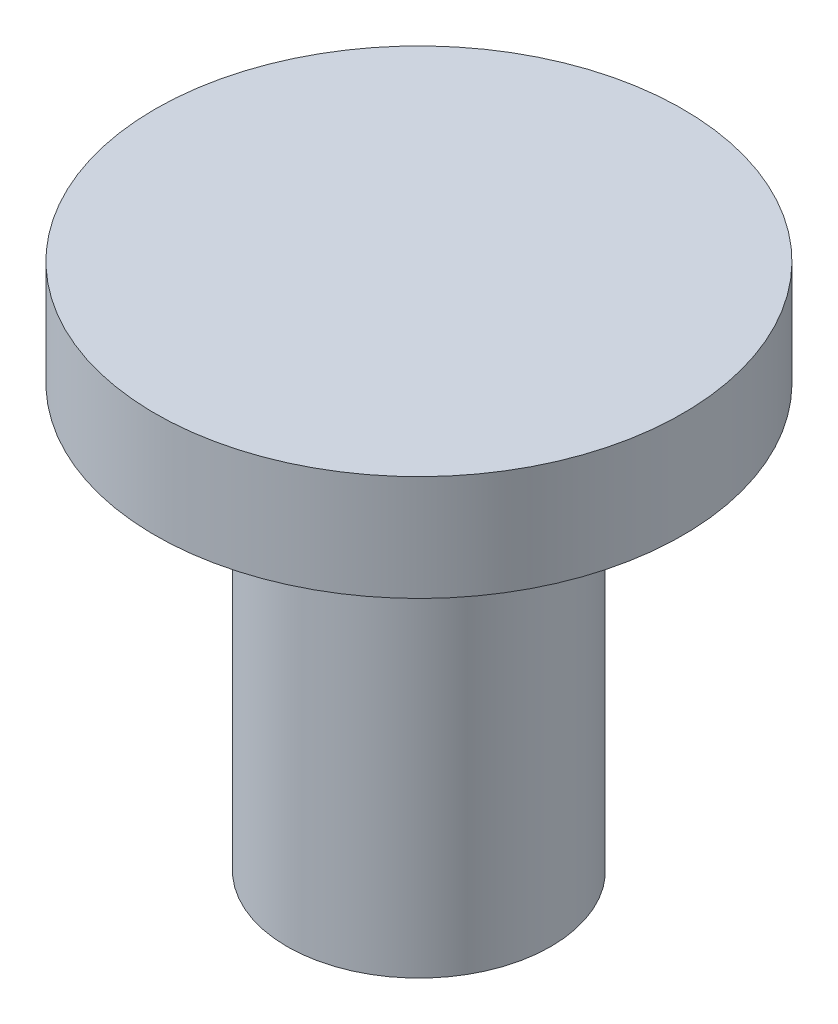
ISO-10303-21;
HEADER;
FILE_DESCRIPTION(('STEP AP214'),'2;1');
FILE_NAME('part.step','',(''),(''),'','','');
FILE_SCHEMA(('AUTOMOTIVE_DESIGN { 1 0 10303 214 1 1 1 1 }'));
ENDSEC;
DATA;
#1=APPLICATION_CONTEXT('core data for automotive mechanical design processes');
#2=APPLICATION_PROTOCOL_DEFINITION('international standard','automotive_design',2000,#1);
#3=PRODUCT_CONTEXT('',#1,'mechanical');
#4=PRODUCT('Part','Part','',(#3));
#5=PRODUCT_RELATED_PRODUCT_CATEGORY('part','',(#4));
#6=PRODUCT_DEFINITION_FORMATION('','',#4);
#7=PRODUCT_DEFINITION_CONTEXT('part definition',#1,'design');
#8=PRODUCT_DEFINITION('design','',#6,#7);
#9=PRODUCT_DEFINITION_SHAPE('','',#8);
#10=(LENGTH_UNIT() NAMED_UNIT(*) SI_UNIT(.MILLI.,.METRE.));
#11=(NAMED_UNIT(*) PLANE_ANGLE_UNIT() SI_UNIT($,.RADIAN.));
#12=(NAMED_UNIT(*) SI_UNIT($,.STERADIAN.) SOLID_ANGLE_UNIT());
#13=UNCERTAINTY_MEASURE_WITH_UNIT(LENGTH_MEASURE(1.E-05),#10,'distance_accuracy_value','');
#14=(GEOMETRIC_REPRESENTATION_CONTEXT(3) GLOBAL_UNCERTAINTY_ASSIGNED_CONTEXT((#13)) GLOBAL_UNIT_ASSIGNED_CONTEXT((#10,
#11,#12)) REPRESENTATION_CONTEXT('',''));
#15=CARTESIAN_POINT('',(0.,0.,0.));
#16=DIRECTION('',(0.,0.,1.));
#17=DIRECTION('',(1.,0.,0.));
#18=AXIS2_PLACEMENT_3D('',#15,#16,#17);
#19=CARTESIAN_POINT('',(3.175,0.,0.));
#20=DIRECTION('',(0.,-1.,0.));
#21=DIRECTION('',(1.,0.,0.));
#22=AXIS2_PLACEMENT_3D('',#19,#20,#21);
#23=PLANE('',#22);
#24=CARTESIAN_POINT('',(0.,0.,0.));
#25=DIRECTION('',(0.,1.,0.));
#26=DIRECTION('',(-1.,0.,0.));
#27=AXIS2_PLACEMENT_3D('',#24,#25,#26);
#28=CIRCLE('',#27,3.175);
#29=CARTESIAN_POINT('',(-3.175,0.,0.));
#30=VERTEX_POINT('',#29);
#31=EDGE_CURVE('E54',#30,#30,#28,.T.);
#32=ORIENTED_EDGE('',*,*,#31,.T.);
#33=EDGE_LOOP('',(#32));
#34=FACE_BOUND('',#33,.T.);
#35=ADVANCED_FACE('F37',(#34),#23,.F.);
#36=CARTESIAN_POINT('',(0.,-6.35,0.));
#37=DIRECTION('',(0.,1.,0.));
#38=DIRECTION('',(-1.,0.,0.));
#39=AXIS2_PLACEMENT_3D('',#36,#37,#38);
#40=PLANE('',#39);
#41=CARTESIAN_POINT('',(0.,-6.35,0.));
#42=DIRECTION('',(0.,1.,0.));
#43=DIRECTION('',(-1.,0.,0.));
#44=AXIS2_PLACEMENT_3D('',#41,#42,#43);
#45=CIRCLE('',#44,1.5875);
#46=CARTESIAN_POINT('',(-1.58749999999999,-6.35000000000001,0.));
#47=VERTEX_POINT('',#46);
#48=EDGE_CURVE('E10',#47,#47,#45,.T.);
#49=ORIENTED_EDGE('',*,*,#48,.F.);
#50=EDGE_LOOP('',(#49));
#51=FACE_BOUND('',#50,.T.);
#52=ADVANCED_FACE('F75',(#51),#40,.F.);
#53=CARTESIAN_POINT('',(0.,0.,0.));
#54=DIRECTION('',(0.,1.,0.));
#55=DIRECTION('',(-1.,0.,0.));
#56=AXIS2_PLACEMENT_3D('',#53,#54,#55);
#57=CYLINDRICAL_SURFACE('',#56,1.5875);
#58=CARTESIAN_POINT('',(0.,-1.27,0.));
#59=DIRECTION('',(0.,1.,0.));
#60=DIRECTION('',(-1.,0.,0.));
#61=AXIS2_PLACEMENT_3D('',#58,#59,#60);
#62=CIRCLE('',#61,1.5875);
#63=CARTESIAN_POINT('',(-1.5875,-1.27000000000001,0.));
#64=VERTEX_POINT('',#63);
#65=EDGE_CURVE('E44',#64,#64,#62,.T.);
#66=ORIENTED_EDGE('',*,*,#65,.F.);
#67=EDGE_LOOP('',(#66));
#68=FACE_BOUND('',#67,.T.);
#69=ORIENTED_EDGE('',*,*,#48,.T.);
#70=EDGE_LOOP('',(#69));
#71=FACE_BOUND('',#70,.T.);
#72=ADVANCED_FACE('F70',(#68,#71),#57,.T.);
#73=CARTESIAN_POINT('',(1.58750000000001,-1.27,0.));
#74=DIRECTION('',(0.,1.,0.));
#75=DIRECTION('',(-1.,0.,0.));
#76=AXIS2_PLACEMENT_3D('',#73,#74,#75);
#77=PLANE('',#76);
#78=CARTESIAN_POINT('',(0.,-1.27,0.));
#79=DIRECTION('',(0.,1.,0.));
#80=DIRECTION('',(-1.,0.,0.));
#81=AXIS2_PLACEMENT_3D('',#78,#79,#80);
#82=CIRCLE('',#81,3.175);
#83=CARTESIAN_POINT('',(-3.175,-1.27000000000001,0.));
#84=VERTEX_POINT('',#83);
#85=EDGE_CURVE('E49',#84,#84,#82,.T.);
#86=ORIENTED_EDGE('',*,*,#85,.F.);
#87=EDGE_LOOP('',(#86));
#88=FACE_BOUND('',#87,.T.);
#89=ORIENTED_EDGE('',*,*,#65,.T.);
#90=EDGE_LOOP('',(#89));
#91=FACE_BOUND('',#90,.T.);
#92=ADVANCED_FACE('F65',(#88,#91),#77,.F.);
#93=CARTESIAN_POINT('',(0.,0.,0.));
#94=DIRECTION('',(0.,1.,0.));
#95=DIRECTION('',(-1.,0.,0.));
#96=AXIS2_PLACEMENT_3D('',#93,#94,#95);
#97=CYLINDRICAL_SURFACE('',#96,3.175);
#98=ORIENTED_EDGE('',*,*,#31,.F.);
#99=EDGE_LOOP('',(#98));
#100=FACE_BOUND('',#99,.T.);
#101=ORIENTED_EDGE('',*,*,#85,.T.);
#102=EDGE_LOOP('',(#101));
#103=FACE_BOUND('',#102,.T.);
#104=ADVANCED_FACE('F62',(#100,#103),#97,.T.);
#105=CLOSED_SHELL('',(#35,#52,#72,#92,#104));
#106=MANIFOLD_SOLID_BREP('B2',#105);
#107=ADVANCED_BREP_SHAPE_REPRESENTATION('',(#18,#106),#14);
#108=SHAPE_DEFINITION_REPRESENTATION(#9,#107);
ENDSEC;
END-ISO-10303-21;
